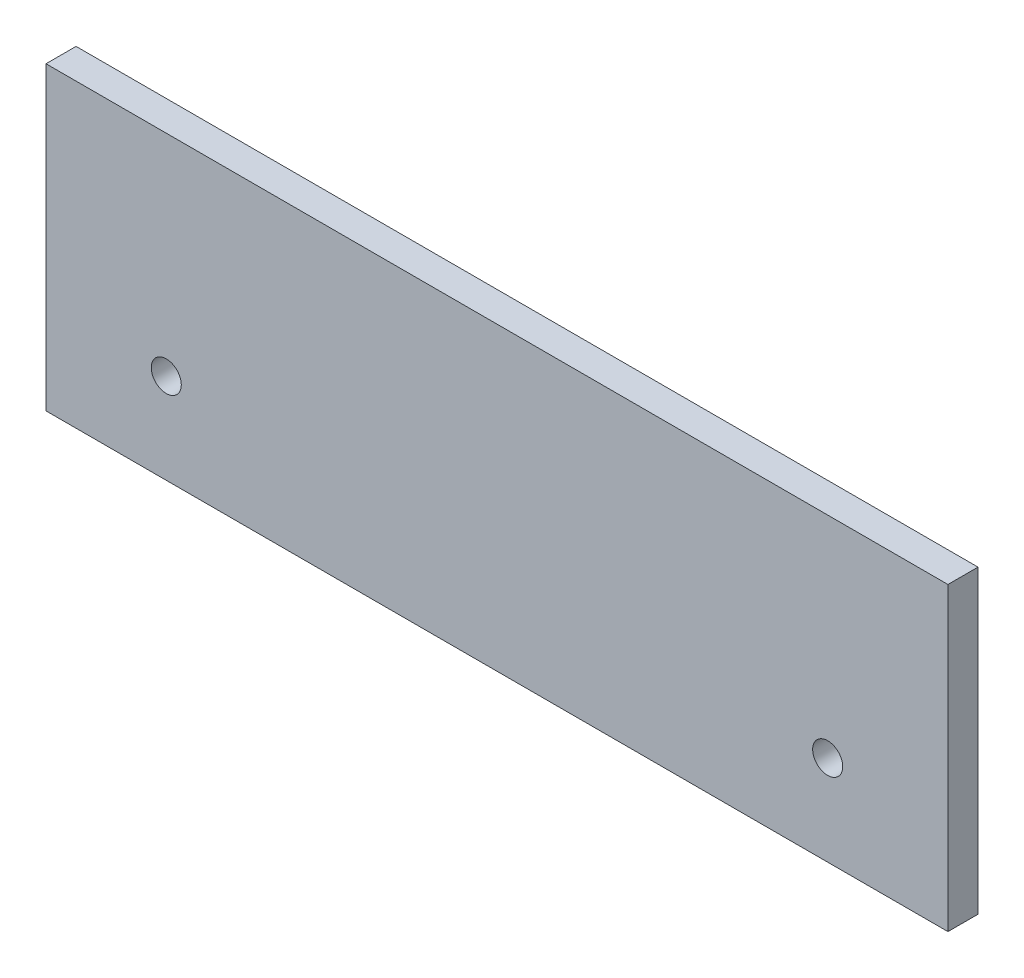
ISO-10303-21;
HEADER;
FILE_DESCRIPTION(('STEP AP214'),'2;1');
FILE_NAME('part.step','',(''),(''),'','','');
FILE_SCHEMA(('AUTOMOTIVE_DESIGN { 1 0 10303 214 1 1 1 1 }'));
ENDSEC;
DATA;
#1=APPLICATION_CONTEXT('core data for automotive mechanical design processes');
#2=APPLICATION_PROTOCOL_DEFINITION('international standard','automotive_design',2000,#1);
#3=PRODUCT_CONTEXT('',#1,'mechanical');
#4=PRODUCT('Part','Part','',(#3));
#5=PRODUCT_RELATED_PRODUCT_CATEGORY('part','',(#4));
#6=PRODUCT_DEFINITION_FORMATION('','',#4);
#7=PRODUCT_DEFINITION_CONTEXT('part definition',#1,'design');
#8=PRODUCT_DEFINITION('design','',#6,#7);
#9=PRODUCT_DEFINITION_SHAPE('','',#8);
#10=(LENGTH_UNIT() NAMED_UNIT(*) SI_UNIT(.MILLI.,.METRE.));
#11=(NAMED_UNIT(*) PLANE_ANGLE_UNIT() SI_UNIT($,.RADIAN.));
#12=(NAMED_UNIT(*) SI_UNIT($,.STERADIAN.) SOLID_ANGLE_UNIT());
#13=UNCERTAINTY_MEASURE_WITH_UNIT(LENGTH_MEASURE(1.E-05),#10,'distance_accuracy_value','');
#14=(GEOMETRIC_REPRESENTATION_CONTEXT(3) GLOBAL_UNCERTAINTY_ASSIGNED_CONTEXT((#13)) GLOBAL_UNIT_ASSIGNED_CONTEXT((#10,
#11,#12)) REPRESENTATION_CONTEXT('',''));
#15=CARTESIAN_POINT('',(0.,0.,0.));
#16=DIRECTION('',(0.,0.,1.));
#17=DIRECTION('',(1.,0.,0.));
#18=AXIS2_PLACEMENT_3D('',#15,#16,#17);
#19=CARTESIAN_POINT('',(-182.776128729886,-100.,10.));
#20=DIRECTION('',(1.,0.,0.));
#21=DIRECTION('',(0.,0.,-1.));
#22=AXIS2_PLACEMENT_3D('',#19,#20,#21);
#23=PLANE('',#22);
#24=DIRECTION('',(0.,-1.,0.));
#25=VECTOR('',#24,1.);
#26=CARTESIAN_POINT('',(-182.776128729886,-100.,0.));
#27=LINE('',#26,#25);
#28=CARTESIAN_POINT('',(-182.776128729886,0.,0.));
#29=VERTEX_POINT('',#28);
#30=CARTESIAN_POINT('',(-182.776128729886,-100.,0.));
#31=VERTEX_POINT('',#30);
#32=EDGE_CURVE('E96',#29,#31,#27,.T.);
#33=ORIENTED_EDGE('',*,*,#32,.T.);
#34=DIRECTION('',(0.,0.,-1.));
#35=VECTOR('',#34,1.);
#36=CARTESIAN_POINT('',(-182.776128729886,-100.,10.));
#37=LINE('',#36,#35);
#38=CARTESIAN_POINT('',(-182.776128729886,-100.,10.));
#39=VERTEX_POINT('',#38);
#40=EDGE_CURVE('E11',#39,#31,#37,.T.);
#41=ORIENTED_EDGE('',*,*,#40,.F.);
#42=DIRECTION('',(0.,-1.,0.));
#43=VECTOR('',#42,1.);
#44=CARTESIAN_POINT('',(-182.776128729886,-100.,10.));
#45=LINE('',#44,#43);
#46=CARTESIAN_POINT('',(-182.776128729886,0.,10.));
#47=VERTEX_POINT('',#46);
#48=EDGE_CURVE('E84',#47,#39,#45,.T.);
#49=ORIENTED_EDGE('',*,*,#48,.F.);
#50=DIRECTION('',(0.,0.,-1.));
#51=VECTOR('',#50,1.);
#52=CARTESIAN_POINT('',(-182.776128729886,0.,10.));
#53=LINE('',#52,#51);
#54=EDGE_CURVE('E92',#47,#29,#53,.T.);
#55=ORIENTED_EDGE('',*,*,#54,.T.);
#56=EDGE_LOOP('',(#33,#41,#49,#55));
#57=FACE_BOUND('',#56,.T.);
#58=ADVANCED_FACE('F33',(#57),#23,.F.);
#59=CARTESIAN_POINT('',(117.223871270114,-100.,10.));
#60=DIRECTION('',(0.,1.,0.));
#61=DIRECTION('',(-1.,0.,0.));
#62=AXIS2_PLACEMENT_3D('',#59,#60,#61);
#63=PLANE('',#62);
#64=DIRECTION('',(1.,0.,0.));
#65=VECTOR('',#64,1.);
#66=CARTESIAN_POINT('',(117.223871270114,-100.,0.));
#67=LINE('',#66,#65);
#68=CARTESIAN_POINT('',(117.223871270114,-100.,0.));
#69=VERTEX_POINT('',#68);
#70=EDGE_CURVE('E88',#31,#69,#67,.T.);
#71=ORIENTED_EDGE('',*,*,#70,.T.);
#72=DIRECTION('',(0.,0.,-1.));
#73=VECTOR('',#72,1.);
#74=CARTESIAN_POINT('',(117.223871270114,-100.,10.));
#75=LINE('',#74,#73);
#76=CARTESIAN_POINT('',(117.223871270114,-100.,10.));
#77=VERTEX_POINT('',#76);
#78=EDGE_CURVE('E41',#77,#69,#75,.T.);
#79=ORIENTED_EDGE('',*,*,#78,.F.);
#80=DIRECTION('',(1.,0.,0.));
#81=VECTOR('',#80,1.);
#82=CARTESIAN_POINT('',(117.223871270114,-100.,10.));
#83=LINE('',#82,#81);
#84=EDGE_CURVE('E79',#39,#77,#83,.T.);
#85=ORIENTED_EDGE('',*,*,#84,.F.);
#86=ORIENTED_EDGE('',*,*,#40,.T.);
#87=EDGE_LOOP('',(#71,#79,#85,#86));
#88=FACE_BOUND('',#87,.T.);
#89=ADVANCED_FACE('F87',(#88),#63,.F.);
#90=CARTESIAN_POINT('',(117.223871270114,0.,10.));
#91=DIRECTION('',(-1.,0.,0.));
#92=DIRECTION('',(0.,-1.,0.));
#93=AXIS2_PLACEMENT_3D('',#90,#91,#92);
#94=PLANE('',#93);
#95=DIRECTION('',(0.,1.,0.));
#96=VECTOR('',#95,1.);
#97=CARTESIAN_POINT('',(117.223871270114,0.,0.));
#98=LINE('',#97,#96);
#99=CARTESIAN_POINT('',(117.223871270114,0.,0.));
#100=VERTEX_POINT('',#99);
#101=EDGE_CURVE('E66',#69,#100,#98,.T.);
#102=ORIENTED_EDGE('',*,*,#101,.T.);
#103=DIRECTION('',(0.,0.,-1.));
#104=VECTOR('',#103,1.);
#105=CARTESIAN_POINT('',(117.223871270114,0.,10.));
#106=LINE('',#105,#104);
#107=CARTESIAN_POINT('',(117.223871270114,0.,10.));
#108=VERTEX_POINT('',#107);
#109=EDGE_CURVE('E89',#108,#100,#106,.T.);
#110=ORIENTED_EDGE('',*,*,#109,.F.);
#111=DIRECTION('',(0.,1.,0.));
#112=VECTOR('',#111,1.);
#113=CARTESIAN_POINT('',(117.223871270114,0.,10.));
#114=LINE('',#113,#112);
#115=EDGE_CURVE('E82',#77,#108,#114,.T.);
#116=ORIENTED_EDGE('',*,*,#115,.F.);
#117=ORIENTED_EDGE('',*,*,#78,.T.);
#118=EDGE_LOOP('',(#102,#110,#116,#117));
#119=FACE_BOUND('',#118,.T.);
#120=ADVANCED_FACE('F90',(#119),#94,.F.);
#121=CARTESIAN_POINT('',(-182.776128729886,0.,10.));
#122=DIRECTION('',(0.,-1.,0.));
#123=DIRECTION('',(0.,0.,-1.));
#124=AXIS2_PLACEMENT_3D('',#121,#122,#123);
#125=PLANE('',#124);
#126=DIRECTION('',(-1.,0.,0.));
#127=VECTOR('',#126,1.);
#128=CARTESIAN_POINT('',(-182.776128729886,0.,0.));
#129=LINE('',#128,#127);
#130=EDGE_CURVE('E72',#100,#29,#129,.T.);
#131=ORIENTED_EDGE('',*,*,#130,.T.);
#132=ORIENTED_EDGE('',*,*,#54,.F.);
#133=DIRECTION('',(-1.,0.,0.));
#134=VECTOR('',#133,1.);
#135=CARTESIAN_POINT('',(-182.776128729886,0.,10.));
#136=LINE('',#135,#134);
#137=EDGE_CURVE('E49',#108,#47,#136,.T.);
#138=ORIENTED_EDGE('',*,*,#137,.F.);
#139=ORIENTED_EDGE('',*,*,#109,.T.);
#140=EDGE_LOOP('',(#131,#132,#138,#139));
#141=FACE_BOUND('',#140,.T.);
#142=ADVANCED_FACE('F104',(#141),#125,.F.);
#143=CARTESIAN_POINT('',(0.,0.,10.));
#144=DIRECTION('',(0.,0.,-1.));
#145=DIRECTION('',(-1.,0.,0.));
#146=AXIS2_PLACEMENT_3D('',#143,#144,#145);
#147=PLANE('',#146);
#148=CARTESIAN_POINT('',(77.223871270114,-70.,10.));
#149=DIRECTION('',(0.,0.,1.));
#150=DIRECTION('',(1.,0.,0.));
#151=AXIS2_PLACEMENT_3D('',#148,#149,#150);
#152=CIRCLE('',#151,5.00000000000001);
#153=CARTESIAN_POINT('',(82.223871270114,-70.,10.));
#154=VERTEX_POINT('',#153);
#155=EDGE_CURVE('E116',#154,#154,#152,.T.);
#156=ORIENTED_EDGE('',*,*,#155,.F.);
#157=EDGE_LOOP('',(#156));
#158=FACE_BOUND('',#157,.T.);
#159=CARTESIAN_POINT('',(-142.776128729886,-70.,10.));
#160=DIRECTION('',(0.,0.,1.));
#161=DIRECTION('',(1.,0.,0.));
#162=AXIS2_PLACEMENT_3D('',#159,#160,#161);
#163=CIRCLE('',#162,4.99999999999999);
#164=CARTESIAN_POINT('',(-137.776128729886,-70.,10.));
#165=VERTEX_POINT('',#164);
#166=EDGE_CURVE('E110',#165,#165,#163,.T.);
#167=ORIENTED_EDGE('',*,*,#166,.F.);
#168=EDGE_LOOP('',(#167));
#169=FACE_BOUND('',#168,.T.);
#170=ORIENTED_EDGE('',*,*,#48,.T.);
#171=ORIENTED_EDGE('',*,*,#84,.T.);
#172=ORIENTED_EDGE('',*,*,#115,.T.);
#173=ORIENTED_EDGE('',*,*,#137,.T.);
#174=EDGE_LOOP('',(#170,#171,#172,#173));
#175=FACE_BOUND('',#174,.T.);
#176=ADVANCED_FACE('F80',(#158,#169,#175),#147,.F.);
#177=CARTESIAN_POINT('',(0.,0.,0.));
#178=DIRECTION('',(0.,0.,-1.));
#179=DIRECTION('',(-1.,0.,0.));
#180=AXIS2_PLACEMENT_3D('',#177,#178,#179);
#181=PLANE('',#180);
#182=CARTESIAN_POINT('',(77.223871270114,-70.,0.));
#183=DIRECTION('',(0.,0.,1.));
#184=DIRECTION('',(1.,0.,0.));
#185=AXIS2_PLACEMENT_3D('',#182,#183,#184);
#186=CIRCLE('',#185,5.00000000000001);
#187=CARTESIAN_POINT('',(82.223871270114,-70.,0.));
#188=VERTEX_POINT('',#187);
#189=EDGE_CURVE('E113',#188,#188,#186,.T.);
#190=ORIENTED_EDGE('',*,*,#189,.T.);
#191=EDGE_LOOP('',(#190));
#192=FACE_BOUND('',#191,.T.);
#193=CARTESIAN_POINT('',(-142.776128729886,-70.,0.));
#194=DIRECTION('',(0.,0.,1.));
#195=DIRECTION('',(1.,0.,0.));
#196=AXIS2_PLACEMENT_3D('',#193,#194,#195);
#197=CIRCLE('',#196,4.99999999999999);
#198=CARTESIAN_POINT('',(-137.776128729886,-70.,0.));
#199=VERTEX_POINT('',#198);
#200=EDGE_CURVE('E99',#199,#199,#197,.T.);
#201=ORIENTED_EDGE('',*,*,#200,.T.);
#202=EDGE_LOOP('',(#201));
#203=FACE_BOUND('',#202,.T.);
#204=ORIENTED_EDGE('',*,*,#32,.F.);
#205=ORIENTED_EDGE('',*,*,#130,.F.);
#206=ORIENTED_EDGE('',*,*,#101,.F.);
#207=ORIENTED_EDGE('',*,*,#70,.F.);
#208=EDGE_LOOP('',(#204,#205,#206,#207));
#209=FACE_BOUND('',#208,.T.);
#210=ADVANCED_FACE('F107',(#192,#203,#209),#181,.T.);
#211=CARTESIAN_POINT('',(-142.776128729886,-70.,0.));
#212=DIRECTION('',(0.,0.,1.));
#213=DIRECTION('',(1.,0.,0.));
#214=AXIS2_PLACEMENT_3D('',#211,#212,#213);
#215=CYLINDRICAL_SURFACE('',#214,4.99999999999999);
#216=ORIENTED_EDGE('',*,*,#200,.F.);
#217=EDGE_LOOP('',(#216));
#218=FACE_BOUND('',#217,.T.);
#219=ORIENTED_EDGE('',*,*,#166,.T.);
#220=EDGE_LOOP('',(#219));
#221=FACE_BOUND('',#220,.T.);
#222=ADVANCED_FACE('F127',(#218,#221),#215,.F.);
#223=CARTESIAN_POINT('',(77.223871270114,-70.,0.));
#224=DIRECTION('',(0.,0.,1.));
#225=DIRECTION('',(1.,0.,0.));
#226=AXIS2_PLACEMENT_3D('',#223,#224,#225);
#227=CYLINDRICAL_SURFACE('',#226,5.00000000000001);
#228=ORIENTED_EDGE('',*,*,#189,.F.);
#229=EDGE_LOOP('',(#228));
#230=FACE_BOUND('',#229,.T.);
#231=ORIENTED_EDGE('',*,*,#155,.T.);
#232=EDGE_LOOP('',(#231));
#233=FACE_BOUND('',#232,.T.);
#234=ADVANCED_FACE('F124',(#230,#233),#227,.F.);
#235=CLOSED_SHELL('',(#58,#89,#120,#142,#176,#210,#222,#234));
#236=MANIFOLD_SOLID_BREP('B2',#235);
#237=ADVANCED_BREP_SHAPE_REPRESENTATION('',(#18,#236),#14);
#238=SHAPE_DEFINITION_REPRESENTATION(#9,#237);
ENDSEC;
END-ISO-10303-21;
